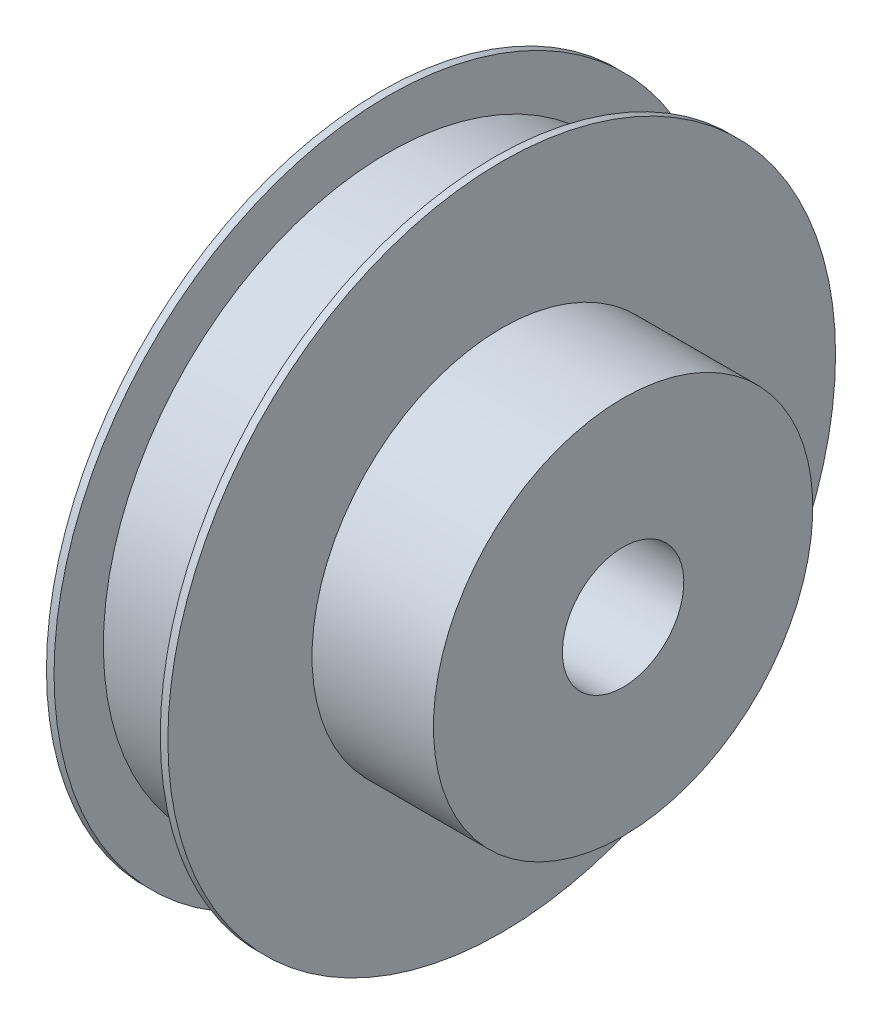
ISO-10303-21;
HEADER;
FILE_DESCRIPTION(('STEP AP214'),'2;1');
FILE_NAME('part.step','',(''),(''),'','','');
FILE_SCHEMA(('AUTOMOTIVE_DESIGN { 1 0 10303 214 1 1 1 1 }'));
ENDSEC;
DATA;
#1=APPLICATION_CONTEXT('core data for automotive mechanical design processes');
#2=APPLICATION_PROTOCOL_DEFINITION('international standard','automotive_design',2000,#1);
#3=PRODUCT_CONTEXT('',#1,'mechanical');
#4=PRODUCT('Part','Part','',(#3));
#5=PRODUCT_RELATED_PRODUCT_CATEGORY('part','',(#4));
#6=PRODUCT_DEFINITION_FORMATION('','',#4);
#7=PRODUCT_DEFINITION_CONTEXT('part definition',#1,'design');
#8=PRODUCT_DEFINITION('design','',#6,#7);
#9=PRODUCT_DEFINITION_SHAPE('','',#8);
#10=(LENGTH_UNIT() NAMED_UNIT(*) SI_UNIT(.MILLI.,.METRE.));
#11=(NAMED_UNIT(*) PLANE_ANGLE_UNIT() SI_UNIT($,.RADIAN.));
#12=(NAMED_UNIT(*) SI_UNIT($,.STERADIAN.) SOLID_ANGLE_UNIT());
#13=UNCERTAINTY_MEASURE_WITH_UNIT(LENGTH_MEASURE(1.E-05),#10,'distance_accuracy_value','');
#14=(GEOMETRIC_REPRESENTATION_CONTEXT(3) GLOBAL_UNCERTAINTY_ASSIGNED_CONTEXT((#13)) GLOBAL_UNIT_ASSIGNED_CONTEXT((#10,
#11,#12)) REPRESENTATION_CONTEXT('',''));
#15=CARTESIAN_POINT('',(0.,0.,0.));
#16=DIRECTION('',(0.,0.,1.));
#17=DIRECTION('',(1.,0.,0.));
#18=AXIS2_PLACEMENT_3D('',#15,#16,#17);
#19=CARTESIAN_POINT('',(-392.389488130962,80.,-481.831385650571));
#20=DIRECTION('',(1.,0.,-9.63416846300191E-13));
#21=DIRECTION('',(0.,1.,0.));
#22=AXIS2_PLACEMENT_3D('',#19,#20,#21);
#23=CYLINDRICAL_SURFACE('',#22,22.);
#24=CARTESIAN_POINT('',(-384.389488131962,80.,-481.831385650579));
#25=DIRECTION('',(-1.,0.,9.63416846300191E-13));
#26=DIRECTION('',(0.,-1.,0.));
#27=AXIS2_PLACEMENT_3D('',#24,#25,#26);
#28=CIRCLE('',#27,22.);
#29=CARTESIAN_POINT('',(-384.389488131962,58.,-481.831385650579));
#30=VERTEX_POINT('',#29);
#31=EDGE_CURVE('E47',#30,#30,#28,.T.);
#32=ORIENTED_EDGE('',*,*,#31,.T.);
#33=EDGE_LOOP('',(#32));
#34=FACE_BOUND('',#33,.T.);
#35=CARTESIAN_POINT('',(-384.889488130962,80.,-481.831385650579));
#36=DIRECTION('',(-1.,0.,9.63416846300191E-13));
#37=DIRECTION('',(0.,-1.,0.));
#38=AXIS2_PLACEMENT_3D('',#35,#36,#37);
#39=CIRCLE('',#38,22.);
#40=CARTESIAN_POINT('',(-384.889488130962,58.,-481.831385650579));
#41=VERTEX_POINT('',#40);
#42=EDGE_CURVE('E55',#41,#41,#39,.T.);
#43=ORIENTED_EDGE('',*,*,#42,.F.);
#44=EDGE_LOOP('',(#43));
#45=FACE_BOUND('',#44,.T.);
#46=ADVANCED_FACE('F31',(#34,#45),#23,.T.);
#47=CARTESIAN_POINT('',(-392.389488130962,80.,-481.831385650571));
#48=DIRECTION('',(-1.,0.,9.63416846300191E-13));
#49=DIRECTION('',(0.,-1.,0.));
#50=AXIS2_PLACEMENT_3D('',#47,#48,#49);
#51=CIRCLE('',#50,22.);
#52=CARTESIAN_POINT('',(-392.389488130962,58.,-481.831385650571));
#53=VERTEX_POINT('',#52);
#54=EDGE_CURVE('E46',#53,#53,#51,.T.);
#55=ORIENTED_EDGE('',*,*,#54,.F.);
#56=EDGE_LOOP('',(#55));
#57=FACE_BOUND('',#56,.T.);
#58=CARTESIAN_POINT('',(-391.889488130962,80.,-481.831385650572));
#59=DIRECTION('',(-1.,0.,9.63416846300191E-13));
#60=DIRECTION('',(0.,-1.,0.));
#61=AXIS2_PLACEMENT_3D('',#58,#59,#60);
#62=CIRCLE('',#61,22.);
#63=CARTESIAN_POINT('',(-391.889488130962,58.,-481.831385650572));
#64=VERTEX_POINT('',#63);
#65=EDGE_CURVE('E64',#64,#64,#62,.T.);
#66=ORIENTED_EDGE('',*,*,#65,.T.);
#67=EDGE_LOOP('',(#66));
#68=FACE_BOUND('',#67,.T.);
#69=ADVANCED_FACE('F68',(#57,#68),#23,.T.);
#70=CARTESIAN_POINT('',(-376.389488231962,80.,-481.831385650587));
#71=DIRECTION('',(-1.,0.,9.63416846300191E-13));
#72=DIRECTION('',(0.,-1.,0.));
#73=AXIS2_PLACEMENT_3D('',#70,#71,#72);
#74=PLANE('',#73);
#75=CARTESIAN_POINT('',(-376.389488231962,80.,-481.831385650587));
#76=DIRECTION('',(-1.,0.,9.63416846300191E-13));
#77=DIRECTION('',(0.,-1.,0.));
#78=AXIS2_PLACEMENT_3D('',#75,#76,#77);
#79=CIRCLE('',#78,12.5);
#80=CARTESIAN_POINT('',(-376.389488231962,67.5,-481.831385650587));
#81=VERTEX_POINT('',#80);
#82=EDGE_CURVE('E35',#81,#81,#79,.T.);
#83=ORIENTED_EDGE('',*,*,#82,.F.);
#84=EDGE_LOOP('',(#83));
#85=FACE_BOUND('',#84,.T.);
#86=CARTESIAN_POINT('',(-376.389488231962,80.,-481.831385650587));
#87=DIRECTION('',(-1.,0.,9.63416846300191E-13));
#88=DIRECTION('',(0.,-1.,0.));
#89=AXIS2_PLACEMENT_3D('',#86,#87,#88);
#90=CIRCLE('',#89,3.999995);
#91=CARTESIAN_POINT('',(-376.389488231962,76.000005,-481.831385650587));
#92=VERTEX_POINT('',#91);
#93=EDGE_CURVE('E42',#92,#92,#90,.T.);
#94=ORIENTED_EDGE('',*,*,#93,.T.);
#95=EDGE_LOOP('',(#94));
#96=FACE_BOUND('',#95,.T.);
#97=ADVANCED_FACE('F87',(#85,#96),#74,.F.);
#98=CARTESIAN_POINT('',(-384.389488131962,80.,-481.831385650579));
#99=DIRECTION('',(1.,0.,-9.63416846300191E-13));
#100=DIRECTION('',(0.,1.,0.));
#101=AXIS2_PLACEMENT_3D('',#98,#99,#100);
#102=CYLINDRICAL_SURFACE('',#101,12.5);
#103=CARTESIAN_POINT('',(-384.389488131962,80.,-481.831385650579));
#104=DIRECTION('',(-1.,0.,9.63416846300191E-13));
#105=DIRECTION('',(0.,-1.,0.));
#106=AXIS2_PLACEMENT_3D('',#103,#104,#105);
#107=CIRCLE('',#106,12.5);
#108=CARTESIAN_POINT('',(-384.389488131962,67.5,-481.831385650579));
#109=VERTEX_POINT('',#108);
#110=EDGE_CURVE('E10',#109,#109,#107,.T.);
#111=ORIENTED_EDGE('',*,*,#110,.F.);
#112=EDGE_LOOP('',(#111));
#113=FACE_BOUND('',#112,.T.);
#114=ORIENTED_EDGE('',*,*,#82,.T.);
#115=EDGE_LOOP('',(#114));
#116=FACE_BOUND('',#115,.T.);
#117=ADVANCED_FACE('F33',(#113,#116),#102,.T.);
#118=CARTESIAN_POINT('',(-384.389488131962,80.,-481.831385650579));
#119=DIRECTION('',(1.,0.,-9.63416846300191E-13));
#120=DIRECTION('',(0.,1.,0.));
#121=AXIS2_PLACEMENT_3D('',#118,#119,#120);
#122=CYLINDRICAL_SURFACE('',#121,3.999995);
#123=ORIENTED_EDGE('',*,*,#93,.F.);
#124=EDGE_LOOP('',(#123));
#125=FACE_BOUND('',#124,.T.);
#126=CARTESIAN_POINT('',(-392.389488130962,80.,-481.831385650571));
#127=DIRECTION('',(-1.,0.,9.63416846300191E-13));
#128=DIRECTION('',(0.,-1.,0.));
#129=AXIS2_PLACEMENT_3D('',#126,#127,#128);
#130=CIRCLE('',#129,3.999995);
#131=CARTESIAN_POINT('',(-392.389488130962,76.000005,-481.831385650571));
#132=VERTEX_POINT('',#131);
#133=EDGE_CURVE('E50',#132,#132,#130,.T.);
#134=ORIENTED_EDGE('',*,*,#133,.T.);
#135=EDGE_LOOP('',(#134));
#136=FACE_BOUND('',#135,.T.);
#137=ADVANCED_FACE('F94',(#125,#136),#122,.F.);
#138=CARTESIAN_POINT('',(-392.389488130962,80.,-481.831385650571));
#139=DIRECTION('',(-1.,0.,9.63416846300191E-13));
#140=DIRECTION('',(0.,-1.,0.));
#141=AXIS2_PLACEMENT_3D('',#138,#139,#140);
#142=PLANE('',#141);
#143=ORIENTED_EDGE('',*,*,#54,.T.);
#144=EDGE_LOOP('',(#143));
#145=FACE_BOUND('',#144,.T.);
#146=ORIENTED_EDGE('',*,*,#133,.F.);
#147=EDGE_LOOP('',(#146));
#148=FACE_BOUND('',#147,.T.);
#149=ADVANCED_FACE('F96',(#145,#148),#142,.T.);
#150=CARTESIAN_POINT('',(-384.389488131962,80.,-481.831385650579));
#151=DIRECTION('',(-1.,0.,9.63416846300191E-13));
#152=DIRECTION('',(0.,-1.,0.));
#153=AXIS2_PLACEMENT_3D('',#150,#151,#152);
#154=PLANE('',#153);
#155=ORIENTED_EDGE('',*,*,#110,.T.);
#156=EDGE_LOOP('',(#155));
#157=FACE_BOUND('',#156,.T.);
#158=ORIENTED_EDGE('',*,*,#31,.F.);
#159=EDGE_LOOP('',(#158));
#160=FACE_BOUND('',#159,.T.);
#161=ADVANCED_FACE('F92',(#157,#160),#154,.F.);
#162=CARTESIAN_POINT('',(-384.889488130962,102.,-481.831385650579));
#163=DIRECTION('',(-1.,0.,9.63416846300191E-13));
#164=DIRECTION('',(0.,-1.,0.));
#165=AXIS2_PLACEMENT_3D('',#162,#163,#164);
#166=PLANE('',#165);
#167=ORIENTED_EDGE('',*,*,#42,.T.);
#168=EDGE_LOOP('',(#167));
#169=FACE_BOUND('',#168,.T.);
#170=CARTESIAN_POINT('',(-384.889488130962,80.,-481.831385650579));
#171=DIRECTION('',(-1.,0.,9.63416846300191E-13));
#172=DIRECTION('',(0.,-1.,0.));
#173=AXIS2_PLACEMENT_3D('',#170,#171,#172);
#174=CIRCLE('',#173,18.75);
#175=CARTESIAN_POINT('',(-384.889488130962,61.25,-481.831385650579));
#176=VERTEX_POINT('',#175);
#177=EDGE_CURVE('E58',#176,#176,#174,.T.);
#178=ORIENTED_EDGE('',*,*,#177,.F.);
#179=EDGE_LOOP('',(#178));
#180=FACE_BOUND('',#179,.T.);
#181=ADVANCED_FACE('F78',(#169,#180),#166,.T.);
#182=CARTESIAN_POINT('',(-394.389478231962,80.,-481.831385650569));
#183=DIRECTION('',(-1.,0.,9.63416846300191E-13));
#184=DIRECTION('',(0.,-1.,0.));
#185=AXIS2_PLACEMENT_3D('',#182,#183,#184);
#186=CYLINDRICAL_SURFACE('',#185,18.75);
#187=ORIENTED_EDGE('',*,*,#177,.T.);
#188=EDGE_LOOP('',(#187));
#189=FACE_BOUND('',#188,.T.);
#190=CARTESIAN_POINT('',(-391.889488130962,80.,-481.831385650572));
#191=DIRECTION('',(-1.,0.,9.63416846300191E-13));
#192=DIRECTION('',(0.,-1.,0.));
#193=AXIS2_PLACEMENT_3D('',#190,#191,#192);
#194=CIRCLE('',#193,18.75);
#195=CARTESIAN_POINT('',(-391.889488130962,61.25,-481.831385650572));
#196=VERTEX_POINT('',#195);
#197=EDGE_CURVE('E61',#196,#196,#194,.T.);
#198=ORIENTED_EDGE('',*,*,#197,.F.);
#199=EDGE_LOOP('',(#198));
#200=FACE_BOUND('',#199,.T.);
#201=ADVANCED_FACE('F72',(#189,#200),#186,.T.);
#202=CARTESIAN_POINT('',(-391.889488130962,102.,-481.831385650572));
#203=DIRECTION('',(1.,0.,-9.63416846300191E-13));
#204=DIRECTION('',(0.,1.,0.));
#205=AXIS2_PLACEMENT_3D('',#202,#203,#204);
#206=PLANE('',#205);
#207=ORIENTED_EDGE('',*,*,#197,.T.);
#208=EDGE_LOOP('',(#207));
#209=FACE_BOUND('',#208,.T.);
#210=ORIENTED_EDGE('',*,*,#65,.F.);
#211=EDGE_LOOP('',(#210));
#212=FACE_BOUND('',#211,.T.);
#213=ADVANCED_FACE('F70',(#209,#212),#206,.T.);
#214=CLOSED_SHELL('',(#46,#69,#97,#117,#137,#149,#161,#181,#201,#213));
#215=MANIFOLD_SOLID_BREP('B2',#214);
#216=ADVANCED_BREP_SHAPE_REPRESENTATION('',(#18,#215),#14);
#217=SHAPE_DEFINITION_REPRESENTATION(#9,#216);
ENDSEC;
END-ISO-10303-21;
